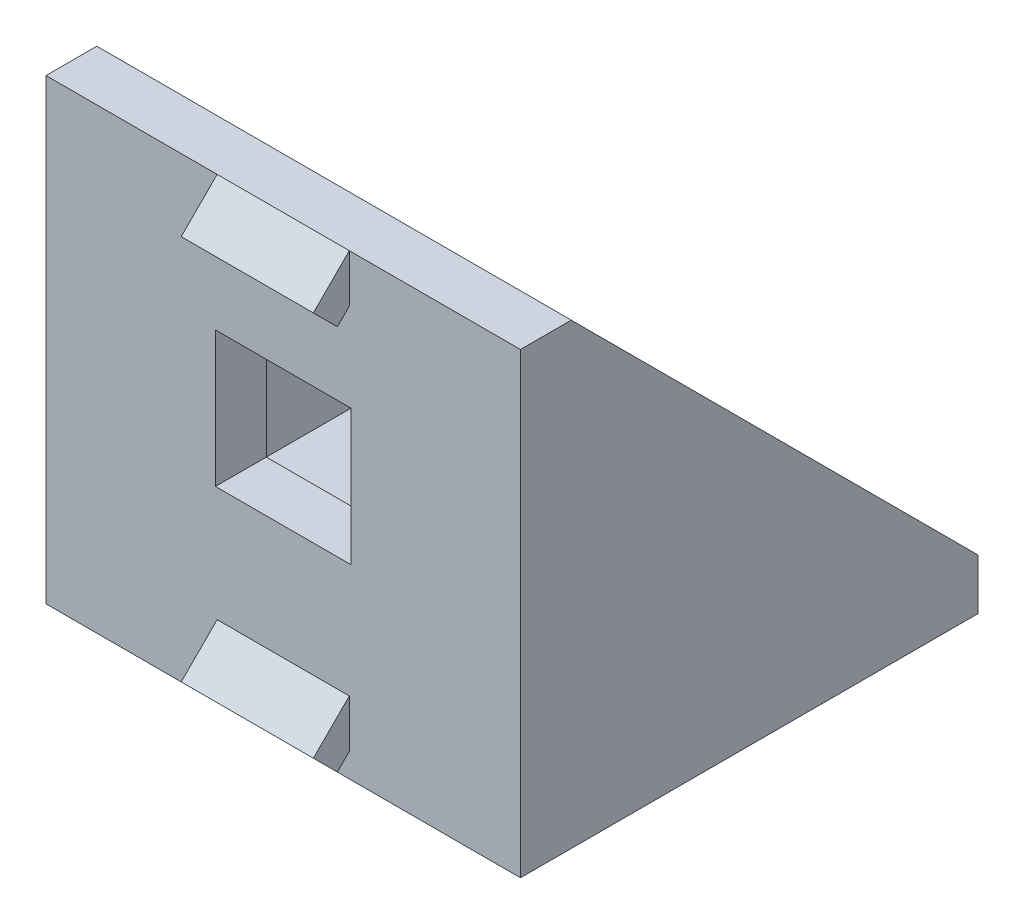
ISO-10303-21;
HEADER;
FILE_DESCRIPTION(('STEP AP214'),'2;1');
FILE_NAME('part.step','',(''),(''),'','','');
FILE_SCHEMA(('AUTOMOTIVE_DESIGN { 1 0 10303 214 1 1 1 1 }'));
ENDSEC;
DATA;
#1=APPLICATION_CONTEXT('core data for automotive mechanical design processes');
#2=APPLICATION_PROTOCOL_DEFINITION('international standard','automotive_design',2000,#1);
#3=PRODUCT_CONTEXT('',#1,'mechanical');
#4=PRODUCT('Part','Part','',(#3));
#5=PRODUCT_RELATED_PRODUCT_CATEGORY('part','',(#4));
#6=PRODUCT_DEFINITION_FORMATION('','',#4);
#7=PRODUCT_DEFINITION_CONTEXT('part definition',#1,'design');
#8=PRODUCT_DEFINITION('design','',#6,#7);
#9=PRODUCT_DEFINITION_SHAPE('','',#8);
#10=(LENGTH_UNIT() NAMED_UNIT(*) SI_UNIT(.MILLI.,.METRE.));
#11=(NAMED_UNIT(*) PLANE_ANGLE_UNIT() SI_UNIT($,.RADIAN.));
#12=(NAMED_UNIT(*) SI_UNIT($,.STERADIAN.) SOLID_ANGLE_UNIT());
#13=UNCERTAINTY_MEASURE_WITH_UNIT(LENGTH_MEASURE(1.E-05),#10,'distance_accuracy_value','');
#14=(GEOMETRIC_REPRESENTATION_CONTEXT(3) GLOBAL_UNCERTAINTY_ASSIGNED_CONTEXT((#13)) GLOBAL_UNIT_ASSIGNED_CONTEXT((#10,
#11,#12)) REPRESENTATION_CONTEXT('',''));
#15=CARTESIAN_POINT('',(0.,0.,0.));
#16=DIRECTION('',(0.,0.,1.));
#17=DIRECTION('',(1.,0.,0.));
#18=AXIS2_PLACEMENT_3D('',#15,#16,#17);
#19=CARTESIAN_POINT('',(28.,0.,0.));
#20=DIRECTION('',(0.,1.,0.));
#21=DIRECTION('',(0.,0.,1.));
#22=AXIS2_PLACEMENT_3D('',#19,#20,#21);
#23=PLANE('',#22);
#24=DIRECTION('',(-1.,0.,0.));
#25=VECTOR('',#24,1.);
#26=CARTESIAN_POINT('',(28.,0.,-27.));
#27=LINE('',#26,#25);
#28=CARTESIAN_POINT('',(10.1,0.,-27.));
#29=VERTEX_POINT('',#28);
#30=CARTESIAN_POINT('',(0.,0.,-27.));
#31=VERTEX_POINT('',#30);
#32=EDGE_CURVE('E482',#29,#31,#27,.T.);
#33=ORIENTED_EDGE('',*,*,#32,.F.);
#34=DIRECTION('',(0.,0.,1.));
#35=VECTOR('',#34,1.);
#36=CARTESIAN_POINT('',(10.1,0.,-24.1715728752538));
#37=LINE('',#36,#35);
#38=CARTESIAN_POINT('',(10.1,0.,-24.1715728752538));
#39=VERTEX_POINT('',#38);
#40=EDGE_CURVE('E333',#29,#39,#37,.T.);
#41=ORIENTED_EDGE('',*,*,#40,.T.);
#42=DIRECTION('',(-1.,0.,0.));
#43=VECTOR('',#42,1.);
#44=CARTESIAN_POINT('',(17.9,0.,-24.1715728752538));
#45=LINE('',#44,#43);
#46=CARTESIAN_POINT('',(17.9,0.,-24.1715728752538));
#47=VERTEX_POINT('',#46);
#48=EDGE_CURVE('E361',#47,#39,#45,.T.);
#49=ORIENTED_EDGE('',*,*,#48,.F.);
#50=DIRECTION('',(0.,0.,1.));
#51=VECTOR('',#50,1.);
#52=CARTESIAN_POINT('',(17.9,0.,-24.1715728752538));
#53=LINE('',#52,#51);
#54=CARTESIAN_POINT('',(17.9,0.,-27.));
#55=VERTEX_POINT('',#54);
#56=EDGE_CURVE('E334',#55,#47,#53,.T.);
#57=ORIENTED_EDGE('',*,*,#56,.F.);
#58=CARTESIAN_POINT('',(28.,0.,-27.));
#59=VERTEX_POINT('',#58);
#60=EDGE_CURVE('E483',#59,#55,#27,.T.);
#61=ORIENTED_EDGE('',*,*,#60,.F.);
#62=DIRECTION('',(0.,0.,-1.));
#63=VECTOR('',#62,1.);
#64=CARTESIAN_POINT('',(28.,0.,0.));
#65=LINE('',#64,#63);
#66=CARTESIAN_POINT('',(28.,0.,0.));
#67=VERTEX_POINT('',#66);
#68=EDGE_CURVE('E444',#67,#59,#65,.T.);
#69=ORIENTED_EDGE('',*,*,#68,.F.);
#70=DIRECTION('',(-1.,0.,0.));
#71=VECTOR('',#70,1.);
#72=CARTESIAN_POINT('',(28.,0.,0.));
#73=LINE('',#72,#71);
#74=CARTESIAN_POINT('',(0.,0.,0.));
#75=VERTEX_POINT('',#74);
#76=EDGE_CURVE('E456',#67,#75,#73,.T.);
#77=ORIENTED_EDGE('',*,*,#76,.T.);
#78=DIRECTION('',(0.,0.,-1.));
#79=VECTOR('',#78,1.);
#80=CARTESIAN_POINT('',(0.,0.,0.));
#81=LINE('',#80,#79);
#82=EDGE_CURVE('E443',#75,#31,#81,.T.);
#83=ORIENTED_EDGE('',*,*,#82,.T.);
#84=EDGE_LOOP('',(#33,#41,#49,#57,#61,#69,#77,#83));
#85=FACE_BOUND('',#84,.T.);
#86=DIRECTION('',(1.,0.,0.));
#87=VECTOR('',#86,1.);
#88=CARTESIAN_POINT('',(10.,0.,-19.));
#89=LINE('',#88,#87);
#90=CARTESIAN_POINT('',(10.,0.,-19.));
#91=VERTEX_POINT('',#90);
#92=CARTESIAN_POINT('',(18.,0.,-19.));
#93=VERTEX_POINT('',#92);
#94=EDGE_CURVE('E366',#91,#93,#89,.T.);
#95=ORIENTED_EDGE('',*,*,#94,.F.);
#96=DIRECTION('',(0.,0.,-1.));
#97=VECTOR('',#96,1.);
#98=CARTESIAN_POINT('',(10.,0.,-11.));
#99=LINE('',#98,#97);
#100=CARTESIAN_POINT('',(10.,0.,-11.));
#101=VERTEX_POINT('',#100);
#102=EDGE_CURVE('E369',#101,#91,#99,.T.);
#103=ORIENTED_EDGE('',*,*,#102,.F.);
#104=DIRECTION('',(-1.,0.,0.));
#105=VECTOR('',#104,1.);
#106=CARTESIAN_POINT('',(10.,0.,-11.));
#107=LINE('',#106,#105);
#108=CARTESIAN_POINT('',(18.,0.,-11.));
#109=VERTEX_POINT('',#108);
#110=EDGE_CURVE('E386',#109,#101,#107,.T.);
#111=ORIENTED_EDGE('',*,*,#110,.F.);
#112=DIRECTION('',(0.,0.,1.));
#113=VECTOR('',#112,1.);
#114=CARTESIAN_POINT('',(18.,0.,-11.));
#115=LINE('',#114,#113);
#116=EDGE_CURVE('E364',#93,#109,#115,.T.);
#117=ORIENTED_EDGE('',*,*,#116,.F.);
#118=EDGE_LOOP('',(#95,#103,#111,#117));
#119=FACE_BOUND('',#118,.T.);
#120=DIRECTION('',(0.,0.,1.));
#121=VECTOR('',#120,1.);
#122=CARTESIAN_POINT('',(17.9,0.,-1.41421356237308));
#123=LINE('',#122,#121);
#124=CARTESIAN_POINT('',(17.9,0.,-4.24264068711928));
#125=VERTEX_POINT('',#124);
#126=CARTESIAN_POINT('',(17.9,0.,-1.41421356237308));
#127=VERTEX_POINT('',#126);
#128=EDGE_CURVE('E305',#125,#127,#123,.T.);
#129=ORIENTED_EDGE('',*,*,#128,.F.);
#130=DIRECTION('',(-1.,0.,0.));
#131=VECTOR('',#130,1.);
#132=CARTESIAN_POINT('',(17.9,0.,-4.24264068711928));
#133=LINE('',#132,#131);
#134=CARTESIAN_POINT('',(10.1,0.,-4.24264068711928));
#135=VERTEX_POINT('',#134);
#136=EDGE_CURVE('E315',#125,#135,#133,.T.);
#137=ORIENTED_EDGE('',*,*,#136,.T.);
#138=DIRECTION('',(0.,0.,1.));
#139=VECTOR('',#138,1.);
#140=CARTESIAN_POINT('',(10.1,0.,-1.41421356237308));
#141=LINE('',#140,#139);
#142=CARTESIAN_POINT('',(10.1,0.,-1.41421356237308));
#143=VERTEX_POINT('',#142);
#144=EDGE_CURVE('E304',#135,#143,#141,.T.);
#145=ORIENTED_EDGE('',*,*,#144,.T.);
#146=DIRECTION('',(-1.,0.,0.));
#147=VECTOR('',#146,1.);
#148=CARTESIAN_POINT('',(17.9,0.,-1.41421356237308));
#149=LINE('',#148,#147);
#150=EDGE_CURVE('E331',#127,#143,#149,.T.);
#151=ORIENTED_EDGE('',*,*,#150,.F.);
#152=EDGE_LOOP('',(#129,#137,#145,#151));
#153=FACE_BOUND('',#152,.T.);
#154=ADVANCED_FACE('F38',(#85,#119,#153),#23,.F.);
#155=CARTESIAN_POINT('',(28.,27.,-3.));
#156=DIRECTION('',(0.,-0.707106781186547,0.707106781186547));
#157=DIRECTION('',(0.,-0.707106781186548,-0.707106781186548));
#158=AXIS2_PLACEMENT_3D('',#155,#156,#157);
#159=PLANE('',#158);
#160=DIRECTION('',(-1.,0.,0.));
#161=VECTOR('',#160,1.);
#162=CARTESIAN_POINT('',(28.,27.,-3.));
#163=LINE('',#162,#161);
#164=CARTESIAN_POINT('',(2.,27.,-3.));
#165=VERTEX_POINT('',#164);
#166=CARTESIAN_POINT('',(0.,27.,-3.));
#167=VERTEX_POINT('',#166);
#168=EDGE_CURVE('E474',#165,#167,#163,.T.);
#169=ORIENTED_EDGE('',*,*,#168,.F.);
#170=DIRECTION('',(0.,-0.707106781186547,-0.707106781186547));
#171=VECTOR('',#170,1.);
#172=CARTESIAN_POINT('',(2.,27.,-3.));
#173=LINE('',#172,#171);
#174=CARTESIAN_POINT('',(2.,3.,-27.));
#175=VERTEX_POINT('',#174);
#176=EDGE_CURVE('E12',#165,#175,#173,.T.);
#177=ORIENTED_EDGE('',*,*,#176,.T.);
#178=DIRECTION('',(-1.,0.,0.));
#179=VECTOR('',#178,1.);
#180=CARTESIAN_POINT('',(28.,3.,-27.));
#181=LINE('',#180,#179);
#182=CARTESIAN_POINT('',(0.,3.,-27.));
#183=VERTEX_POINT('',#182);
#184=EDGE_CURVE('E478',#175,#183,#181,.T.);
#185=ORIENTED_EDGE('',*,*,#184,.T.);
#186=DIRECTION('',(0.,0.707106781186548,0.707106781186548));
#187=VECTOR('',#186,1.);
#188=CARTESIAN_POINT('',(0.,27.,-3.));
#189=LINE('',#188,#187);
#190=EDGE_CURVE('E462',#183,#167,#189,.T.);
#191=ORIENTED_EDGE('',*,*,#190,.T.);
#192=EDGE_LOOP('',(#169,#177,#185,#191));
#193=FACE_BOUND('',#192,.T.);
#194=ADVANCED_FACE('F514',(#193),#159,.F.);
#195=CARTESIAN_POINT('',(28.,3.,-27.));
#196=DIRECTION('',(0.,0.,1.));
#197=DIRECTION('',(1.,0.,0.));
#198=AXIS2_PLACEMENT_3D('',#195,#196,#197);
#199=PLANE('',#198);
#200=DIRECTION('',(0.,1.,0.));
#201=VECTOR('',#200,1.);
#202=CARTESIAN_POINT('',(0.,3.,-27.));
#203=LINE('',#202,#201);
#204=EDGE_CURVE('E459',#31,#183,#203,.T.);
#205=ORIENTED_EDGE('',*,*,#204,.T.);
#206=ORIENTED_EDGE('',*,*,#184,.F.);
#207=DIRECTION('',(-1.,0.,0.));
#208=VECTOR('',#207,1.);
#209=CARTESIAN_POINT('',(2.,3.,-27.));
#210=LINE('',#209,#208);
#211=CARTESIAN_POINT('',(26.,3.,-27.));
#212=VERTEX_POINT('',#211);
#213=EDGE_CURVE('E426',#212,#175,#210,.T.);
#214=ORIENTED_EDGE('',*,*,#213,.F.);
#215=CARTESIAN_POINT('',(28.,3.,-27.));
#216=VERTEX_POINT('',#215);
#217=EDGE_CURVE('E479',#216,#212,#181,.T.);
#218=ORIENTED_EDGE('',*,*,#217,.F.);
#219=DIRECTION('',(0.,1.,0.));
#220=VECTOR('',#219,1.);
#221=CARTESIAN_POINT('',(28.,3.,-27.));
#222=LINE('',#221,#220);
#223=EDGE_CURVE('E447',#59,#216,#222,.T.);
#224=ORIENTED_EDGE('',*,*,#223,.F.);
#225=ORIENTED_EDGE('',*,*,#60,.T.);
#226=DIRECTION('',(-1.,0.,0.));
#227=VECTOR('',#226,1.);
#228=CARTESIAN_POINT('',(17.9,0.,-27.));
#229=LINE('',#228,#227);
#230=EDGE_CURVE('E345',#55,#29,#229,.T.);
#231=ORIENTED_EDGE('',*,*,#230,.T.);
#232=ORIENTED_EDGE('',*,*,#32,.T.);
#233=EDGE_LOOP('',(#205,#206,#214,#218,#224,#225,#231,#232));
#234=FACE_BOUND('',#233,.T.);
#235=ADVANCED_FACE('F506',(#234),#199,.F.);
#236=ORIENTED_EDGE('',*,*,#217,.T.);
#237=DIRECTION('',(0.,0.707106781186547,0.707106781186547));
#238=VECTOR('',#237,1.);
#239=CARTESIAN_POINT('',(26.,27.,-3.));
#240=LINE('',#239,#238);
#241=CARTESIAN_POINT('',(26.,27.,-2.99999999999999));
#242=VERTEX_POINT('',#241);
#243=EDGE_CURVE('E45',#212,#242,#240,.T.);
#244=ORIENTED_EDGE('',*,*,#243,.T.);
#245=CARTESIAN_POINT('',(28.,27.,-3.));
#246=VERTEX_POINT('',#245);
#247=EDGE_CURVE('E475',#246,#242,#163,.T.);
#248=ORIENTED_EDGE('',*,*,#247,.F.);
#249=DIRECTION('',(0.,0.707106781186548,0.707106781186548));
#250=VECTOR('',#249,1.);
#251=CARTESIAN_POINT('',(28.,27.,-3.));
#252=LINE('',#251,#250);
#253=EDGE_CURVE('E450',#216,#246,#252,.T.);
#254=ORIENTED_EDGE('',*,*,#253,.F.);
#255=EDGE_LOOP('',(#236,#244,#248,#254));
#256=FACE_BOUND('',#255,.T.);
#257=ADVANCED_FACE('F488',(#256),#159,.F.);
#258=CARTESIAN_POINT('',(28.,27.,0.));
#259=DIRECTION('',(0.,-1.,0.));
#260=DIRECTION('',(0.,0.,-1.));
#261=AXIS2_PLACEMENT_3D('',#258,#259,#260);
#262=PLANE('',#261);
#263=DIRECTION('',(0.,0.,1.));
#264=VECTOR('',#263,1.);
#265=CARTESIAN_POINT('',(0.,27.,0.));
#266=LINE('',#265,#264);
#267=CARTESIAN_POINT('',(0.,27.,0.));
#268=VERTEX_POINT('',#267);
#269=EDGE_CURVE('E465',#167,#268,#266,.T.);
#270=ORIENTED_EDGE('',*,*,#269,.T.);
#271=DIRECTION('',(-1.,0.,0.));
#272=VECTOR('',#271,1.);
#273=CARTESIAN_POINT('',(28.,27.,0.));
#274=LINE('',#273,#272);
#275=CARTESIAN_POINT('',(10.1,27.,0.));
#276=VERTEX_POINT('',#275);
#277=EDGE_CURVE('E471',#276,#268,#274,.T.);
#278=ORIENTED_EDGE('',*,*,#277,.F.);
#279=DIRECTION('',(-1.,0.,0.));
#280=VECTOR('',#279,1.);
#281=CARTESIAN_POINT('',(17.9,27.,0.));
#282=LINE('',#281,#280);
#283=CARTESIAN_POINT('',(17.9,27.,0.));
#284=VERTEX_POINT('',#283);
#285=EDGE_CURVE('E660',#284,#276,#282,.T.);
#286=ORIENTED_EDGE('',*,*,#285,.F.);
#287=CARTESIAN_POINT('',(28.,27.,0.));
#288=VERTEX_POINT('',#287);
#289=EDGE_CURVE('E472',#288,#284,#274,.T.);
#290=ORIENTED_EDGE('',*,*,#289,.F.);
#291=DIRECTION('',(0.,0.,1.));
#292=VECTOR('',#291,1.);
#293=CARTESIAN_POINT('',(28.,27.,0.));
#294=LINE('',#293,#292);
#295=EDGE_CURVE('E452',#246,#288,#294,.T.);
#296=ORIENTED_EDGE('',*,*,#295,.F.);
#297=ORIENTED_EDGE('',*,*,#247,.T.);
#298=DIRECTION('',(-1.,0.,0.));
#299=VECTOR('',#298,1.);
#300=CARTESIAN_POINT('',(2.,27.,-3.));
#301=LINE('',#300,#299);
#302=EDGE_CURVE('E434',#242,#165,#301,.T.);
#303=ORIENTED_EDGE('',*,*,#302,.T.);
#304=ORIENTED_EDGE('',*,*,#168,.T.);
#305=EDGE_LOOP('',(#270,#278,#286,#290,#296,#297,#303,#304));
#306=FACE_BOUND('',#305,.T.);
#307=ADVANCED_FACE('F495',(#306),#262,.F.);
#308=CARTESIAN_POINT('',(28.,0.,0.));
#309=DIRECTION('',(0.,0.,-1.));
#310=DIRECTION('',(-1.,0.,0.));
#311=AXIS2_PLACEMENT_3D('',#308,#309,#310);
#312=PLANE('',#311);
#313=DIRECTION('',(-1.,0.,0.));
#314=VECTOR('',#313,1.);
#315=CARTESIAN_POINT('',(17.9,4.24264068711882,-1.56502576304842E-13));
#316=LINE('',#315,#314);
#317=CARTESIAN_POINT('',(17.9,4.24264068711866,0.));
#318=VERTEX_POINT('',#317);
#319=CARTESIAN_POINT('',(10.1,4.24264068711882,0.));
#320=VERTEX_POINT('',#319);
#321=EDGE_CURVE('E287',#318,#320,#316,.T.);
#322=ORIENTED_EDGE('',*,*,#321,.F.);
#323=DIRECTION('',(0.,1.,-1.65607518986913E-13));
#324=VECTOR('',#323,1.);
#325=CARTESIAN_POINT('',(17.9,1.4142135623733,3.11906222459551E-13));
#326=LINE('',#325,#324);
#327=CARTESIAN_POINT('',(17.9,1.41421356237361,0.));
#328=VERTEX_POINT('',#327);
#329=EDGE_CURVE('E285',#328,#318,#326,.T.);
#330=ORIENTED_EDGE('',*,*,#329,.F.);
#331=DIRECTION('',(-1.,0.,0.));
#332=VECTOR('',#331,1.);
#333=CARTESIAN_POINT('',(17.9,1.4142135623733,3.11906222459551E-13));
#334=LINE('',#333,#332);
#335=CARTESIAN_POINT('',(10.1,1.4142135623733,3.11906222459551E-13));
#336=VERTEX_POINT('',#335);
#337=EDGE_CURVE('E296',#328,#336,#334,.T.);
#338=ORIENTED_EDGE('',*,*,#337,.T.);
#339=DIRECTION('',(0.,1.,-1.65607518986913E-13));
#340=VECTOR('',#339,1.);
#341=CARTESIAN_POINT('',(10.1,1.4142135623733,3.11906222459551E-13));
#342=LINE('',#341,#340);
#343=EDGE_CURVE('E280',#336,#320,#342,.T.);
#344=ORIENTED_EDGE('',*,*,#343,.T.);
#345=EDGE_LOOP('',(#322,#330,#338,#344));
#346=FACE_BOUND('',#345,.T.);
#347=DIRECTION('',(1.,0.,0.));
#348=VECTOR('',#347,1.);
#349=CARTESIAN_POINT('',(10.,11.,0.));
#350=LINE('',#349,#348);
#351=CARTESIAN_POINT('',(10.,11.,0.));
#352=VERTEX_POINT('',#351);
#353=CARTESIAN_POINT('',(18.,11.,0.));
#354=VERTEX_POINT('',#353);
#355=EDGE_CURVE('E397',#352,#354,#350,.T.);
#356=ORIENTED_EDGE('',*,*,#355,.F.);
#357=DIRECTION('',(0.,-1.,0.));
#358=VECTOR('',#357,1.);
#359=CARTESIAN_POINT('',(10.,19.,0.));
#360=LINE('',#359,#358);
#361=CARTESIAN_POINT('',(10.,19.,0.));
#362=VERTEX_POINT('',#361);
#363=EDGE_CURVE('E400',#362,#352,#360,.T.);
#364=ORIENTED_EDGE('',*,*,#363,.F.);
#365=DIRECTION('',(-1.,0.,0.));
#366=VECTOR('',#365,1.);
#367=CARTESIAN_POINT('',(10.,19.,0.));
#368=LINE('',#367,#366);
#369=CARTESIAN_POINT('',(18.,19.,0.));
#370=VERTEX_POINT('',#369);
#371=EDGE_CURVE('E417',#370,#362,#368,.T.);
#372=ORIENTED_EDGE('',*,*,#371,.F.);
#373=DIRECTION('',(0.,1.,0.));
#374=VECTOR('',#373,1.);
#375=CARTESIAN_POINT('',(18.,19.,0.));
#376=LINE('',#375,#374);
#377=EDGE_CURVE('E395',#354,#370,#376,.T.);
#378=ORIENTED_EDGE('',*,*,#377,.F.);
#379=EDGE_LOOP('',(#356,#364,#372,#378));
#380=FACE_BOUND('',#379,.T.);
#381=ORIENTED_EDGE('',*,*,#289,.T.);
#382=DIRECTION('',(0.,1.,-2.38185905000715E-13));
#383=VECTOR('',#382,1.);
#384=CARTESIAN_POINT('',(17.9,27.,0.));
#385=LINE('',#384,#383);
#386=CARTESIAN_POINT('',(17.9,24.1715728752552,0.));
#387=VERTEX_POINT('',#386);
#388=EDGE_CURVE('E52',#387,#284,#385,.T.);
#389=ORIENTED_EDGE('',*,*,#388,.F.);
#390=DIRECTION('',(-1.,0.,0.));
#391=VECTOR('',#390,1.);
#392=CARTESIAN_POINT('',(17.9,24.1715728752545,6.73691474436078E-13));
#393=LINE('',#392,#391);
#394=CARTESIAN_POINT('',(10.1,24.1715728752545,6.73691474436078E-13));
#395=VERTEX_POINT('',#394);
#396=EDGE_CURVE('E272',#387,#395,#393,.T.);
#397=ORIENTED_EDGE('',*,*,#396,.T.);
#398=DIRECTION('',(0.,1.,-2.38185905000715E-13));
#399=VECTOR('',#398,1.);
#400=CARTESIAN_POINT('',(10.1,27.,0.));
#401=LINE('',#400,#399);
#402=EDGE_CURVE('E58',#395,#276,#401,.T.);
#403=ORIENTED_EDGE('',*,*,#402,.T.);
#404=ORIENTED_EDGE('',*,*,#277,.T.);
#405=DIRECTION('',(0.,-1.,0.));
#406=VECTOR('',#405,1.);
#407=CARTESIAN_POINT('',(0.,0.,0.));
#408=LINE('',#407,#406);
#409=EDGE_CURVE('E448',#268,#75,#408,.T.);
#410=ORIENTED_EDGE('',*,*,#409,.T.);
#411=ORIENTED_EDGE('',*,*,#76,.F.);
#412=DIRECTION('',(0.,-1.,0.));
#413=VECTOR('',#412,1.);
#414=CARTESIAN_POINT('',(28.,0.,0.));
#415=LINE('',#414,#413);
#416=EDGE_CURVE('E454',#288,#67,#415,.T.);
#417=ORIENTED_EDGE('',*,*,#416,.F.);
#418=EDGE_LOOP('',(#381,#389,#397,#403,#404,#410,#411,#417));
#419=FACE_BOUND('',#418,.T.);
#420=ADVANCED_FACE('F640',(#346,#380,#419),#312,.F.);
#421=CARTESIAN_POINT('',(28.,0.,0.));
#422=DIRECTION('',(-1.,0.,0.));
#423=DIRECTION('',(0.,0.,1.));
#424=AXIS2_PLACEMENT_3D('',#421,#422,#423);
#425=PLANE('',#424);
#426=ORIENTED_EDGE('',*,*,#68,.T.);
#427=ORIENTED_EDGE('',*,*,#223,.T.);
#428=ORIENTED_EDGE('',*,*,#253,.T.);
#429=ORIENTED_EDGE('',*,*,#295,.T.);
#430=ORIENTED_EDGE('',*,*,#416,.T.);
#431=EDGE_LOOP('',(#426,#427,#428,#429,#430));
#432=FACE_BOUND('',#431,.T.);
#433=ADVANCED_FACE('F500',(#432),#425,.F.);
#434=CARTESIAN_POINT('',(0.,0.,0.));
#435=DIRECTION('',(-1.,0.,0.));
#436=DIRECTION('',(0.,0.,1.));
#437=AXIS2_PLACEMENT_3D('',#434,#435,#436);
#438=PLANE('',#437);
#439=ORIENTED_EDGE('',*,*,#82,.F.);
#440=ORIENTED_EDGE('',*,*,#409,.F.);
#441=ORIENTED_EDGE('',*,*,#269,.F.);
#442=ORIENTED_EDGE('',*,*,#190,.F.);
#443=ORIENTED_EDGE('',*,*,#204,.F.);
#444=EDGE_LOOP('',(#439,#440,#441,#442,#443));
#445=FACE_BOUND('',#444,.T.);
#446=ADVANCED_FACE('F530',(#445),#438,.T.);
#447=CARTESIAN_POINT('',(2.,3.,33.9411254969543));
#448=DIRECTION('',(-1.,0.,0.));
#449=DIRECTION('',(0.,0.,1.));
#450=AXIS2_PLACEMENT_3D('',#447,#448,#449);
#451=PLANE('',#450);
#452=DIRECTION('',(0.,-1.,0.));
#453=VECTOR('',#452,1.);
#454=CARTESIAN_POINT('',(2.,3.,-3.));
#455=LINE('',#454,#453);
#456=CARTESIAN_POINT('',(2.,3.,-3.));
#457=VERTEX_POINT('',#456);
#458=EDGE_CURVE('E432',#165,#457,#455,.T.);
#459=ORIENTED_EDGE('',*,*,#458,.T.);
#460=DIRECTION('',(0.,0.,-1.));
#461=VECTOR('',#460,1.);
#462=CARTESIAN_POINT('',(2.,3.,33.9411254969543));
#463=LINE('',#462,#461);
#464=EDGE_CURVE('E430',#457,#175,#463,.T.);
#465=ORIENTED_EDGE('',*,*,#464,.T.);
#466=ORIENTED_EDGE('',*,*,#176,.F.);
#467=EDGE_LOOP('',(#459,#465,#466));
#468=FACE_BOUND('',#467,.T.);
#469=ADVANCED_FACE('F516',(#468),#451,.F.);
#470=CARTESIAN_POINT('',(26.,3.,33.9411254969543));
#471=DIRECTION('',(1.,0.,0.));
#472=DIRECTION('',(0.,0.,-1.));
#473=AXIS2_PLACEMENT_3D('',#470,#471,#472);
#474=PLANE('',#473);
#475=DIRECTION('',(0.,0.,-1.));
#476=VECTOR('',#475,1.);
#477=CARTESIAN_POINT('',(26.,3.,33.9411254969543));
#478=LINE('',#477,#476);
#479=CARTESIAN_POINT('',(26.,3.,-3.));
#480=VERTEX_POINT('',#479);
#481=EDGE_CURVE('E437',#480,#212,#478,.T.);
#482=ORIENTED_EDGE('',*,*,#481,.F.);
#483=DIRECTION('',(0.,1.,0.));
#484=VECTOR('',#483,1.);
#485=CARTESIAN_POINT('',(26.,3.,-3.));
#486=LINE('',#485,#484);
#487=EDGE_CURVE('E427',#480,#242,#486,.T.);
#488=ORIENTED_EDGE('',*,*,#487,.T.);
#489=ORIENTED_EDGE('',*,*,#243,.F.);
#490=EDGE_LOOP('',(#482,#488,#489));
#491=FACE_BOUND('',#490,.T.);
#492=ADVANCED_FACE('F521',(#491),#474,.F.);
#493=CARTESIAN_POINT('',(2.,3.,33.9411254969543));
#494=DIRECTION('',(0.,-1.,0.));
#495=DIRECTION('',(1.,0.,0.));
#496=AXIS2_PLACEMENT_3D('',#493,#494,#495);
#497=PLANE('',#496);
#498=DIRECTION('',(1.,0.,0.));
#499=VECTOR('',#498,1.);
#500=CARTESIAN_POINT('',(10.,3.,-11.));
#501=LINE('',#500,#499);
#502=CARTESIAN_POINT('',(10.,3.,-11.));
#503=VERTEX_POINT('',#502);
#504=CARTESIAN_POINT('',(18.,3.,-11.));
#505=VERTEX_POINT('',#504);
#506=EDGE_CURVE('E374',#503,#505,#501,.T.);
#507=ORIENTED_EDGE('',*,*,#506,.F.);
#508=DIRECTION('',(0.,0.,1.));
#509=VECTOR('',#508,1.);
#510=CARTESIAN_POINT('',(10.,3.,-11.));
#511=LINE('',#510,#509);
#512=CARTESIAN_POINT('',(10.,3.,-19.));
#513=VERTEX_POINT('',#512);
#514=EDGE_CURVE('E372',#513,#503,#511,.T.);
#515=ORIENTED_EDGE('',*,*,#514,.F.);
#516=DIRECTION('',(-1.,0.,0.));
#517=VECTOR('',#516,1.);
#518=CARTESIAN_POINT('',(10.,3.,-19.));
#519=LINE('',#518,#517);
#520=CARTESIAN_POINT('',(18.,3.,-19.));
#521=VERTEX_POINT('',#520);
#522=EDGE_CURVE('E380',#521,#513,#519,.T.);
#523=ORIENTED_EDGE('',*,*,#522,.F.);
#524=DIRECTION('',(0.,0.,-1.));
#525=VECTOR('',#524,1.);
#526=CARTESIAN_POINT('',(18.,3.,-11.));
#527=LINE('',#526,#525);
#528=EDGE_CURVE('E377',#505,#521,#527,.T.);
#529=ORIENTED_EDGE('',*,*,#528,.F.);
#530=EDGE_LOOP('',(#507,#515,#523,#529));
#531=FACE_BOUND('',#530,.T.);
#532=DIRECTION('',(1.,0.,0.));
#533=VECTOR('',#532,1.);
#534=CARTESIAN_POINT('',(2.,3.,-3.));
#535=LINE('',#534,#533);
#536=EDGE_CURVE('E429',#457,#480,#535,.T.);
#537=ORIENTED_EDGE('',*,*,#536,.T.);
#538=ORIENTED_EDGE('',*,*,#481,.T.);
#539=ORIENTED_EDGE('',*,*,#213,.T.);
#540=ORIENTED_EDGE('',*,*,#464,.F.);
#541=EDGE_LOOP('',(#537,#538,#539,#540));
#542=FACE_BOUND('',#541,.T.);
#543=ADVANCED_FACE('F510',(#531,#542),#497,.F.);
#544=CARTESIAN_POINT('',(28.,0.,-3.));
#545=DIRECTION('',(0.,0.,-1.));
#546=DIRECTION('',(-1.,0.,0.));
#547=AXIS2_PLACEMENT_3D('',#544,#545,#546);
#548=PLANE('',#547);
#549=DIRECTION('',(0.,1.,0.));
#550=VECTOR('',#549,1.);
#551=CARTESIAN_POINT('',(10.,19.,-3.));
#552=LINE('',#551,#550);
#553=CARTESIAN_POINT('',(10.,11.,-3.));
#554=VERTEX_POINT('',#553);
#555=CARTESIAN_POINT('',(10.,19.,-3.));
#556=VERTEX_POINT('',#555);
#557=EDGE_CURVE('E403',#554,#556,#552,.T.);
#558=ORIENTED_EDGE('',*,*,#557,.F.);
#559=DIRECTION('',(-1.,0.,0.));
#560=VECTOR('',#559,1.);
#561=CARTESIAN_POINT('',(10.,11.,-3.));
#562=LINE('',#561,#560);
#563=CARTESIAN_POINT('',(18.,11.,-3.));
#564=VERTEX_POINT('',#563);
#565=EDGE_CURVE('E411',#564,#554,#562,.T.);
#566=ORIENTED_EDGE('',*,*,#565,.F.);
#567=DIRECTION('',(0.,-1.,0.));
#568=VECTOR('',#567,1.);
#569=CARTESIAN_POINT('',(18.,19.,-3.));
#570=LINE('',#569,#568);
#571=CARTESIAN_POINT('',(18.,19.,-3.));
#572=VERTEX_POINT('',#571);
#573=EDGE_CURVE('E408',#572,#564,#570,.T.);
#574=ORIENTED_EDGE('',*,*,#573,.F.);
#575=DIRECTION('',(1.,0.,0.));
#576=VECTOR('',#575,1.);
#577=CARTESIAN_POINT('',(10.,19.,-3.));
#578=LINE('',#577,#576);
#579=EDGE_CURVE('E405',#556,#572,#578,.T.);
#580=ORIENTED_EDGE('',*,*,#579,.F.);
#581=EDGE_LOOP('',(#558,#566,#574,#580));
#582=FACE_BOUND('',#581,.T.);
#583=ORIENTED_EDGE('',*,*,#458,.F.);
#584=ORIENTED_EDGE('',*,*,#302,.F.);
#585=ORIENTED_EDGE('',*,*,#487,.F.);
#586=ORIENTED_EDGE('',*,*,#536,.F.);
#587=EDGE_LOOP('',(#583,#584,#585,#586));
#588=FACE_BOUND('',#587,.T.);
#589=ADVANCED_FACE('F520',(#582,#588),#548,.T.);
#590=CARTESIAN_POINT('',(10.,19.,0.00100000000000013));
#591=DIRECTION('',(-1.,0.,0.));
#592=DIRECTION('',(0.,-1.,0.));
#593=AXIS2_PLACEMENT_3D('',#590,#591,#592);
#594=PLANE('',#593);
#595=ORIENTED_EDGE('',*,*,#363,.T.);
#596=DIRECTION('',(0.,0.,-1.));
#597=VECTOR('',#596,1.);
#598=CARTESIAN_POINT('',(10.,11.,0.00100000000000013));
#599=LINE('',#598,#597);
#600=EDGE_CURVE('E415',#352,#554,#599,.T.);
#601=ORIENTED_EDGE('',*,*,#600,.T.);
#602=ORIENTED_EDGE('',*,*,#557,.T.);
#603=DIRECTION('',(0.,0.,-1.));
#604=VECTOR('',#603,1.);
#605=CARTESIAN_POINT('',(10.,19.,0.00100000000000013));
#606=LINE('',#605,#604);
#607=EDGE_CURVE('E414',#362,#556,#606,.T.);
#608=ORIENTED_EDGE('',*,*,#607,.F.);
#609=EDGE_LOOP('',(#595,#601,#602,#608));
#610=FACE_BOUND('',#609,.T.);
#611=ADVANCED_FACE('F615',(#610),#594,.F.);
#612=CARTESIAN_POINT('',(10.,11.,0.00100000000000013));
#613=DIRECTION('',(0.,-1.,0.));
#614=DIRECTION('',(1.,0.,0.));
#615=AXIS2_PLACEMENT_3D('',#612,#613,#614);
#616=PLANE('',#615);
#617=ORIENTED_EDGE('',*,*,#355,.T.);
#618=DIRECTION('',(0.,0.,-1.));
#619=VECTOR('',#618,1.);
#620=CARTESIAN_POINT('',(18.,11.,0.00100000000000013));
#621=LINE('',#620,#619);
#622=EDGE_CURVE('E418',#354,#564,#621,.T.);
#623=ORIENTED_EDGE('',*,*,#622,.T.);
#624=ORIENTED_EDGE('',*,*,#565,.T.);
#625=ORIENTED_EDGE('',*,*,#600,.F.);
#626=EDGE_LOOP('',(#617,#623,#624,#625));
#627=FACE_BOUND('',#626,.T.);
#628=ADVANCED_FACE('F611',(#627),#616,.F.);
#629=CARTESIAN_POINT('',(18.,19.,0.00100000000000013));
#630=DIRECTION('',(1.,0.,0.));
#631=DIRECTION('',(0.,0.,-1.));
#632=AXIS2_PLACEMENT_3D('',#629,#630,#631);
#633=PLANE('',#632);
#634=ORIENTED_EDGE('',*,*,#377,.T.);
#635=DIRECTION('',(0.,0.,-1.));
#636=VECTOR('',#635,1.);
#637=CARTESIAN_POINT('',(18.,19.,0.00100000000000013));
#638=LINE('',#637,#636);
#639=EDGE_CURVE('E420',#370,#572,#638,.T.);
#640=ORIENTED_EDGE('',*,*,#639,.T.);
#641=ORIENTED_EDGE('',*,*,#573,.T.);
#642=ORIENTED_EDGE('',*,*,#622,.F.);
#643=EDGE_LOOP('',(#634,#640,#641,#642));
#644=FACE_BOUND('',#643,.T.);
#645=ADVANCED_FACE('F614',(#644),#633,.F.);
#646=CARTESIAN_POINT('',(10.,19.,0.00100000000000013));
#647=DIRECTION('',(0.,1.,0.));
#648=DIRECTION('',(0.,0.,1.));
#649=AXIS2_PLACEMENT_3D('',#646,#647,#648);
#650=PLANE('',#649);
#651=ORIENTED_EDGE('',*,*,#371,.T.);
#652=ORIENTED_EDGE('',*,*,#607,.T.);
#653=ORIENTED_EDGE('',*,*,#579,.T.);
#654=ORIENTED_EDGE('',*,*,#639,.F.);
#655=EDGE_LOOP('',(#651,#652,#653,#654));
#656=FACE_BOUND('',#655,.T.);
#657=ADVANCED_FACE('F609',(#656),#650,.F.);
#658=CARTESIAN_POINT('',(10.,-0.00100000000000057,-11.));
#659=DIRECTION('',(-1.,0.,0.));
#660=DIRECTION('',(0.,-1.,0.));
#661=AXIS2_PLACEMENT_3D('',#658,#659,#660);
#662=PLANE('',#661);
#663=ORIENTED_EDGE('',*,*,#102,.T.);
#664=DIRECTION('',(0.,1.,0.));
#665=VECTOR('',#664,1.);
#666=CARTESIAN_POINT('',(10.,-0.00100000000000057,-19.));
#667=LINE('',#666,#665);
#668=EDGE_CURVE('E384',#91,#513,#667,.T.);
#669=ORIENTED_EDGE('',*,*,#668,.T.);
#670=ORIENTED_EDGE('',*,*,#514,.T.);
#671=DIRECTION('',(0.,1.,0.));
#672=VECTOR('',#671,1.);
#673=CARTESIAN_POINT('',(10.,-0.00100000000000057,-11.));
#674=LINE('',#673,#672);
#675=EDGE_CURVE('E383',#101,#503,#674,.T.);
#676=ORIENTED_EDGE('',*,*,#675,.F.);
#677=EDGE_LOOP('',(#663,#669,#670,#676));
#678=FACE_BOUND('',#677,.T.);
#679=ADVANCED_FACE('F599',(#678),#662,.F.);
#680=CARTESIAN_POINT('',(10.,-0.00100000000000057,-19.));
#681=DIRECTION('',(0.,0.,-1.));
#682=DIRECTION('',(-1.,0.,0.));
#683=AXIS2_PLACEMENT_3D('',#680,#681,#682);
#684=PLANE('',#683);
#685=ORIENTED_EDGE('',*,*,#94,.T.);
#686=DIRECTION('',(0.,1.,0.));
#687=VECTOR('',#686,1.);
#688=CARTESIAN_POINT('',(18.,-0.001000000000001,-19.));
#689=LINE('',#688,#687);
#690=EDGE_CURVE('E387',#93,#521,#689,.T.);
#691=ORIENTED_EDGE('',*,*,#690,.T.);
#692=ORIENTED_EDGE('',*,*,#522,.T.);
#693=ORIENTED_EDGE('',*,*,#668,.F.);
#694=EDGE_LOOP('',(#685,#691,#692,#693));
#695=FACE_BOUND('',#694,.T.);
#696=ADVANCED_FACE('F595',(#695),#684,.F.);
#697=CARTESIAN_POINT('',(18.,-0.001000000000001,-11.));
#698=DIRECTION('',(1.,0.,0.));
#699=DIRECTION('',(0.,1.,0.));
#700=AXIS2_PLACEMENT_3D('',#697,#698,#699);
#701=PLANE('',#700);
#702=ORIENTED_EDGE('',*,*,#116,.T.);
#703=DIRECTION('',(0.,1.,0.));
#704=VECTOR('',#703,1.);
#705=CARTESIAN_POINT('',(18.,-0.001000000000001,-11.));
#706=LINE('',#705,#704);
#707=EDGE_CURVE('E389',#109,#505,#706,.T.);
#708=ORIENTED_EDGE('',*,*,#707,.T.);
#709=ORIENTED_EDGE('',*,*,#528,.T.);
#710=ORIENTED_EDGE('',*,*,#690,.F.);
#711=EDGE_LOOP('',(#702,#708,#709,#710));
#712=FACE_BOUND('',#711,.T.);
#713=ADVANCED_FACE('F598',(#712),#701,.F.);
#714=CARTESIAN_POINT('',(10.,-0.00100000000000057,-11.));
#715=DIRECTION('',(0.,0.,1.));
#716=DIRECTION('',(1.,0.,0.));
#717=AXIS2_PLACEMENT_3D('',#714,#715,#716);
#718=PLANE('',#717);
#719=ORIENTED_EDGE('',*,*,#110,.T.);
#720=ORIENTED_EDGE('',*,*,#675,.T.);
#721=ORIENTED_EDGE('',*,*,#506,.T.);
#722=ORIENTED_EDGE('',*,*,#707,.F.);
#723=EDGE_LOOP('',(#719,#720,#721,#722));
#724=FACE_BOUND('',#723,.T.);
#725=ADVANCED_FACE('F593',(#724),#718,.F.);
#726=CARTESIAN_POINT('',(17.9,-0.707106781186528,-23.4644660940673));
#727=DIRECTION('',(0.,-0.707106781186553,-0.707106781186542));
#728=DIRECTION('',(0.,0.707106781186542,-0.707106781186553));
#729=AXIS2_PLACEMENT_3D('',#726,#727,#728);
#730=PLANE('',#729);
#731=DIRECTION('',(0.,-0.707106781186542,0.707106781186553));
#732=VECTOR('',#731,1.);
#733=CARTESIAN_POINT('',(10.1,-0.707106781186528,-23.4644660940673));
#734=LINE('',#733,#732);
#735=CARTESIAN_POINT('',(10.1,-0.707106781186528,-23.4644660940673));
#736=VERTEX_POINT('',#735);
#737=EDGE_CURVE('E347',#39,#736,#734,.T.);
#738=ORIENTED_EDGE('',*,*,#737,.T.);
#739=DIRECTION('',(-1.,0.,0.));
#740=VECTOR('',#739,1.);
#741=CARTESIAN_POINT('',(17.9,-0.707106781186528,-23.4644660940673));
#742=LINE('',#741,#740);
#743=CARTESIAN_POINT('',(17.9,-0.707106781186528,-23.4644660940673));
#744=VERTEX_POINT('',#743);
#745=EDGE_CURVE('E358',#744,#736,#742,.T.);
#746=ORIENTED_EDGE('',*,*,#745,.F.);
#747=DIRECTION('',(0.,-0.707106781186542,0.707106781186553));
#748=VECTOR('',#747,1.);
#749=CARTESIAN_POINT('',(17.9,-0.707106781186528,-23.4644660940673));
#750=LINE('',#749,#748);
#751=EDGE_CURVE('E337',#47,#744,#750,.T.);
#752=ORIENTED_EDGE('',*,*,#751,.F.);
#753=ORIENTED_EDGE('',*,*,#48,.T.);
#754=EDGE_LOOP('',(#738,#746,#752,#753));
#755=FACE_BOUND('',#754,.T.);
#756=ADVANCED_FACE('F589',(#755),#730,.F.);
#757=CARTESIAN_POINT('',(17.9,-2.12132034355963,-24.8786796564403));
#758=DIRECTION('',(0.,0.707106781186543,-0.707106781186552));
#759=DIRECTION('',(0.,0.707106781186552,0.707106781186543));
#760=AXIS2_PLACEMENT_3D('',#757,#758,#759);
#761=PLANE('',#760);
#762=DIRECTION('',(0.,-0.707106781186552,-0.707106781186543));
#763=VECTOR('',#762,1.);
#764=CARTESIAN_POINT('',(10.1,-2.12132034355963,-24.8786796564403));
#765=LINE('',#764,#763);
#766=CARTESIAN_POINT('',(10.1,-2.12132034355963,-24.8786796564403));
#767=VERTEX_POINT('',#766);
#768=EDGE_CURVE('E349',#736,#767,#765,.T.);
#769=ORIENTED_EDGE('',*,*,#768,.T.);
#770=DIRECTION('',(-1.,0.,0.));
#771=VECTOR('',#770,1.);
#772=CARTESIAN_POINT('',(17.9,-2.12132034355963,-24.8786796564403));
#773=LINE('',#772,#771);
#774=CARTESIAN_POINT('',(17.9,-2.12132034355963,-24.8786796564403));
#775=VERTEX_POINT('',#774);
#776=EDGE_CURVE('E355',#775,#767,#773,.T.);
#777=ORIENTED_EDGE('',*,*,#776,.F.);
#778=DIRECTION('',(0.,-0.707106781186552,-0.707106781186543));
#779=VECTOR('',#778,1.);
#780=CARTESIAN_POINT('',(17.9,-2.12132034355963,-24.8786796564403));
#781=LINE('',#780,#779);
#782=EDGE_CURVE('E340',#744,#775,#781,.T.);
#783=ORIENTED_EDGE('',*,*,#782,.F.);
#784=ORIENTED_EDGE('',*,*,#745,.T.);
#785=EDGE_LOOP('',(#769,#777,#783,#784));
#786=FACE_BOUND('',#785,.T.);
#787=ADVANCED_FACE('F585',(#786),#761,.F.);
#788=CARTESIAN_POINT('',(17.9,0.,-27.));
#789=DIRECTION('',(0.,0.707106781186551,0.707106781186544));
#790=DIRECTION('',(0.,-0.707106781186544,0.707106781186551));
#791=AXIS2_PLACEMENT_3D('',#788,#789,#790);
#792=PLANE('',#791);
#793=DIRECTION('',(0.,0.707106781186544,-0.707106781186551));
#794=VECTOR('',#793,1.);
#795=CARTESIAN_POINT('',(10.1,0.,-27.));
#796=LINE('',#795,#794);
#797=EDGE_CURVE('E338',#767,#29,#796,.T.);
#798=ORIENTED_EDGE('',*,*,#797,.T.);
#799=ORIENTED_EDGE('',*,*,#230,.F.);
#800=DIRECTION('',(0.,0.707106781186544,-0.707106781186551));
#801=VECTOR('',#800,1.);
#802=CARTESIAN_POINT('',(17.9,0.,-27.));
#803=LINE('',#802,#801);
#804=EDGE_CURVE('E342',#775,#55,#803,.T.);
#805=ORIENTED_EDGE('',*,*,#804,.F.);
#806=ORIENTED_EDGE('',*,*,#776,.T.);
#807=EDGE_LOOP('',(#798,#799,#805,#806));
#808=FACE_BOUND('',#807,.T.);
#809=ADVANCED_FACE('F578',(#808),#792,.F.);
#810=CARTESIAN_POINT('',(17.9,0.,0.));
#811=DIRECTION('',(-1.,0.,0.));
#812=DIRECTION('',(0.,0.,1.));
#813=AXIS2_PLACEMENT_3D('',#810,#811,#812);
#814=PLANE('',#813);
#815=ORIENTED_EDGE('',*,*,#56,.T.);
#816=ORIENTED_EDGE('',*,*,#751,.T.);
#817=ORIENTED_EDGE('',*,*,#782,.T.);
#818=ORIENTED_EDGE('',*,*,#804,.T.);
#819=EDGE_LOOP('',(#815,#816,#817,#818));
#820=FACE_BOUND('',#819,.T.);
#821=ADVANCED_FACE('F575',(#820),#814,.F.);
#822=CARTESIAN_POINT('',(10.1,0.,0.));
#823=DIRECTION('',(-1.,0.,0.));
#824=DIRECTION('',(0.,0.,1.));
#825=AXIS2_PLACEMENT_3D('',#822,#823,#824);
#826=PLANE('',#825);
#827=ORIENTED_EDGE('',*,*,#40,.F.);
#828=ORIENTED_EDGE('',*,*,#797,.F.);
#829=ORIENTED_EDGE('',*,*,#768,.F.);
#830=ORIENTED_EDGE('',*,*,#737,.F.);
#831=EDGE_LOOP('',(#827,#828,#829,#830));
#832=FACE_BOUND('',#831,.T.);
#833=ADVANCED_FACE('F571',(#832),#826,.T.);
#834=CARTESIAN_POINT('',(17.9,-0.707106781186547,-0.707106781186547));
#835=DIRECTION('',(0.,-0.707106781186547,-0.707106781186548));
#836=DIRECTION('',(0.,0.707106781186548,-0.707106781186547));
#837=AXIS2_PLACEMENT_3D('',#834,#835,#836);
#838=PLANE('',#837);
#839=DIRECTION('',(0.,-0.707106781186548,0.707106781186547));
#840=VECTOR('',#839,1.);
#841=CARTESIAN_POINT('',(10.1,-0.707106781186547,-0.707106781186547));
#842=LINE('',#841,#840);
#843=CARTESIAN_POINT('',(10.1,-0.707106781186547,-0.707106781186547));
#844=VERTEX_POINT('',#843);
#845=EDGE_CURVE('E318',#143,#844,#842,.T.);
#846=ORIENTED_EDGE('',*,*,#845,.T.);
#847=DIRECTION('',(-1.,0.,0.));
#848=VECTOR('',#847,1.);
#849=CARTESIAN_POINT('',(17.9,-0.707106781186547,-0.707106781186547));
#850=LINE('',#849,#848);
#851=CARTESIAN_POINT('',(17.9,-0.707106781186547,-0.707106781186547));
#852=VERTEX_POINT('',#851);
#853=EDGE_CURVE('E328',#852,#844,#850,.T.);
#854=ORIENTED_EDGE('',*,*,#853,.F.);
#855=DIRECTION('',(0.,-0.707106781186548,0.707106781186547));
#856=VECTOR('',#855,1.);
#857=CARTESIAN_POINT('',(17.9,-0.707106781186547,-0.707106781186547));
#858=LINE('',#857,#856);
#859=EDGE_CURVE('E308',#127,#852,#858,.T.);
#860=ORIENTED_EDGE('',*,*,#859,.F.);
#861=ORIENTED_EDGE('',*,*,#150,.T.);
#862=EDGE_LOOP('',(#846,#854,#860,#861));
#863=FACE_BOUND('',#862,.T.);
#864=ADVANCED_FACE('F561',(#863),#838,.F.);
#865=CARTESIAN_POINT('',(17.9,-2.12132034355964,-2.12132034355964));
#866=DIRECTION('',(0.,0.707106781186548,-0.707106781186547));
#867=DIRECTION('',(0.,0.707106781186547,0.707106781186548));
#868=AXIS2_PLACEMENT_3D('',#865,#866,#867);
#869=PLANE('',#868);
#870=DIRECTION('',(0.,-0.707106781186548,-0.707106781186548));
#871=VECTOR('',#870,1.);
#872=CARTESIAN_POINT('',(10.1,-2.12132034355964,-2.12132034355964));
#873=LINE('',#872,#871);
#874=CARTESIAN_POINT('',(10.1,-2.12132034355964,-2.12132034355964));
#875=VERTEX_POINT('',#874);
#876=EDGE_CURVE('E320',#844,#875,#873,.T.);
#877=ORIENTED_EDGE('',*,*,#876,.T.);
#878=DIRECTION('',(-1.,0.,0.));
#879=VECTOR('',#878,1.);
#880=CARTESIAN_POINT('',(17.9,-2.12132034355964,-2.12132034355964));
#881=LINE('',#880,#879);
#882=CARTESIAN_POINT('',(17.9,-2.12132034355964,-2.12132034355964));
#883=VERTEX_POINT('',#882);
#884=EDGE_CURVE('E325',#883,#875,#881,.T.);
#885=ORIENTED_EDGE('',*,*,#884,.F.);
#886=DIRECTION('',(0.,-0.707106781186548,-0.707106781186548));
#887=VECTOR('',#886,1.);
#888=CARTESIAN_POINT('',(17.9,-2.12132034355964,-2.12132034355964));
#889=LINE('',#888,#887);
#890=EDGE_CURVE('E311',#852,#883,#889,.T.);
#891=ORIENTED_EDGE('',*,*,#890,.F.);
#892=ORIENTED_EDGE('',*,*,#853,.T.);
#893=EDGE_LOOP('',(#877,#885,#891,#892));
#894=FACE_BOUND('',#893,.T.);
#895=ADVANCED_FACE('F563',(#894),#869,.F.);
#896=CARTESIAN_POINT('',(17.9,0.,-4.24264068711928));
#897=DIRECTION('',(0.,0.707106781186547,0.707106781186548));
#898=DIRECTION('',(0.,-0.707106781186548,0.707106781186547));
#899=AXIS2_PLACEMENT_3D('',#896,#897,#898);
#900=PLANE('',#899);
#901=DIRECTION('',(0.,0.707106781186548,-0.707106781186547));
#902=VECTOR('',#901,1.);
#903=CARTESIAN_POINT('',(10.1,0.,-4.24264068711928));
#904=LINE('',#903,#902);
#905=EDGE_CURVE('E309',#875,#135,#904,.T.);
#906=ORIENTED_EDGE('',*,*,#905,.T.);
#907=ORIENTED_EDGE('',*,*,#136,.F.);
#908=DIRECTION('',(0.,0.707106781186548,-0.707106781186547));
#909=VECTOR('',#908,1.);
#910=CARTESIAN_POINT('',(17.9,0.,-4.24264068711928));
#911=LINE('',#910,#909);
#912=EDGE_CURVE('E313',#883,#125,#911,.T.);
#913=ORIENTED_EDGE('',*,*,#912,.F.);
#914=ORIENTED_EDGE('',*,*,#884,.T.);
#915=EDGE_LOOP('',(#906,#907,#913,#914));
#916=FACE_BOUND('',#915,.T.);
#917=ADVANCED_FACE('F553',(#916),#900,.F.);
#918=CARTESIAN_POINT('',(17.9,0.,0.));
#919=DIRECTION('',(-1.,0.,0.));
#920=DIRECTION('',(0.,0.,1.));
#921=AXIS2_PLACEMENT_3D('',#918,#919,#920);
#922=PLANE('',#921);
#923=ORIENTED_EDGE('',*,*,#128,.T.);
#924=ORIENTED_EDGE('',*,*,#859,.T.);
#925=ORIENTED_EDGE('',*,*,#890,.T.);
#926=ORIENTED_EDGE('',*,*,#912,.T.);
#927=EDGE_LOOP('',(#923,#924,#925,#926));
#928=FACE_BOUND('',#927,.T.);
#929=ADVANCED_FACE('F547',(#928),#922,.F.);
#930=CARTESIAN_POINT('',(10.1,0.,0.));
#931=DIRECTION('',(-1.,0.,0.));
#932=DIRECTION('',(0.,0.,1.));
#933=AXIS2_PLACEMENT_3D('',#930,#931,#932);
#934=PLANE('',#933);
#935=ORIENTED_EDGE('',*,*,#144,.F.);
#936=ORIENTED_EDGE('',*,*,#905,.F.);
#937=ORIENTED_EDGE('',*,*,#876,.F.);
#938=ORIENTED_EDGE('',*,*,#845,.F.);
#939=EDGE_LOOP('',(#935,#936,#937,#938));
#940=FACE_BOUND('',#939,.T.);
#941=ADVANCED_FACE('F559',(#940),#934,.T.);
#942=CARTESIAN_POINT('',(17.9,2.12132034355902,2.12132034355933));
#943=DIRECTION('',(0.,-0.707106781186495,-0.7071067811866));
#944=DIRECTION('',(0.,0.7071067811866,-0.707106781186496));
#945=AXIS2_PLACEMENT_3D('',#942,#943,#944);
#946=PLANE('',#945);
#947=DIRECTION('',(0.,-0.7071067811866,0.707106781186496));
#948=VECTOR('',#947,1.);
#949=CARTESIAN_POINT('',(10.1,2.12132034355902,2.12132034355933));
#950=LINE('',#949,#948);
#951=CARTESIAN_POINT('',(10.1,2.12132034355902,2.12132034355933));
#952=VERTEX_POINT('',#951);
#953=EDGE_CURVE('E267',#320,#952,#950,.T.);
#954=ORIENTED_EDGE('',*,*,#953,.T.);
#955=DIRECTION('',(-1.,0.,0.));
#956=VECTOR('',#955,1.);
#957=CARTESIAN_POINT('',(17.9,2.12132034355902,2.12132034355933));
#958=LINE('',#957,#956);
#959=CARTESIAN_POINT('',(17.9,2.12132034355902,2.12132034355933));
#960=VERTEX_POINT('',#959);
#961=EDGE_CURVE('E301',#960,#952,#958,.T.);
#962=ORIENTED_EDGE('',*,*,#961,.F.);
#963=DIRECTION('',(0.,-0.7071067811866,0.707106781186496));
#964=VECTOR('',#963,1.);
#965=CARTESIAN_POINT('',(17.9,2.12132034355902,2.12132034355933));
#966=LINE('',#965,#964);
#967=EDGE_CURVE('E276',#318,#960,#966,.T.);
#968=ORIENTED_EDGE('',*,*,#967,.F.);
#969=ORIENTED_EDGE('',*,*,#321,.T.);
#970=EDGE_LOOP('',(#954,#962,#968,#969));
#971=FACE_BOUND('',#970,.T.);
#972=ADVANCED_FACE('F704',(#971),#946,.F.);
#973=CARTESIAN_POINT('',(17.9,0.707106781186703,0.707106781186807));
#974=DIRECTION('',(0.,0.7071067811866,-0.707106781186495));
#975=DIRECTION('',(0.,0.707106781186495,0.7071067811866));
#976=AXIS2_PLACEMENT_3D('',#973,#974,#975);
#977=PLANE('',#976);
#978=DIRECTION('',(0.,-0.707106781186496,-0.7071067811866));
#979=VECTOR('',#978,1.);
#980=CARTESIAN_POINT('',(10.1,0.707106781186703,0.707106781186807));
#981=LINE('',#980,#979);
#982=CARTESIAN_POINT('',(10.1,0.707106781186703,0.707106781186807));
#983=VERTEX_POINT('',#982);
#984=EDGE_CURVE('E270',#952,#983,#981,.T.);
#985=ORIENTED_EDGE('',*,*,#984,.T.);
#986=DIRECTION('',(-1.,0.,0.));
#987=VECTOR('',#986,1.);
#988=CARTESIAN_POINT('',(17.9,0.707106781186703,0.707106781186807));
#989=LINE('',#988,#987);
#990=CARTESIAN_POINT('',(17.9,0.707106781186703,0.707106781186807));
#991=VERTEX_POINT('',#990);
#992=EDGE_CURVE('E298',#991,#983,#989,.T.);
#993=ORIENTED_EDGE('',*,*,#992,.F.);
#994=DIRECTION('',(0.,-0.707106781186496,-0.7071067811866));
#995=VECTOR('',#994,1.);
#996=CARTESIAN_POINT('',(17.9,0.707106781186703,0.707106781186807));
#997=LINE('',#996,#995);
#998=EDGE_CURVE('E279',#960,#991,#997,.T.);
#999=ORIENTED_EDGE('',*,*,#998,.F.);
#1000=ORIENTED_EDGE('',*,*,#961,.T.);
#1001=EDGE_LOOP('',(#985,#993,#999,#1000));
#1002=FACE_BOUND('',#1001,.T.);
#1003=ADVANCED_FACE('F700',(#1002),#977,.F.);
#1004=CARTESIAN_POINT('',(17.9,1.4142135623733,3.11906222459551E-13));
#1005=DIRECTION('',(0.,0.707106781186496,0.7071067811866));
#1006=DIRECTION('',(0.,-0.7071067811866,0.707106781186496));
#1007=AXIS2_PLACEMENT_3D('',#1004,#1005,#1006);
#1008=PLANE('',#1007);
#1009=DIRECTION('',(0.,0.7071067811866,-0.707106781186496));
#1010=VECTOR('',#1009,1.);
#1011=CARTESIAN_POINT('',(10.1,1.4142135623733,3.11906222459551E-13));
#1012=LINE('',#1011,#1010);
#1013=EDGE_CURVE('E290',#983,#336,#1012,.T.);
#1014=ORIENTED_EDGE('',*,*,#1013,.T.);
#1015=ORIENTED_EDGE('',*,*,#337,.F.);
#1016=DIRECTION('',(0.,0.7071067811866,-0.707106781186496));
#1017=VECTOR('',#1016,1.);
#1018=CARTESIAN_POINT('',(17.9,1.4142135623733,3.11906222459551E-13));
#1019=LINE('',#1018,#1017);
#1020=EDGE_CURVE('E282',#991,#328,#1019,.T.);
#1021=ORIENTED_EDGE('',*,*,#1020,.F.);
#1022=ORIENTED_EDGE('',*,*,#992,.T.);
#1023=EDGE_LOOP('',(#1014,#1015,#1021,#1022));
#1024=FACE_BOUND('',#1023,.T.);
#1025=ADVANCED_FACE('F693',(#1024),#1008,.F.);
#1026=CARTESIAN_POINT('',(17.9,0.,0.));
#1027=DIRECTION('',(1.,0.,0.));
#1028=DIRECTION('',(0.,0.,-1.));
#1029=AXIS2_PLACEMENT_3D('',#1026,#1027,#1028);
#1030=PLANE('',#1029);
#1031=ORIENTED_EDGE('',*,*,#967,.T.);
#1032=ORIENTED_EDGE('',*,*,#998,.T.);
#1033=ORIENTED_EDGE('',*,*,#1020,.T.);
#1034=ORIENTED_EDGE('',*,*,#329,.T.);
#1035=EDGE_LOOP('',(#1031,#1032,#1033,#1034));
#1036=FACE_BOUND('',#1035,.T.);
#1037=ADVANCED_FACE('F690',(#1036),#1030,.T.);
#1038=CARTESIAN_POINT('',(10.1,0.,0.));
#1039=DIRECTION('',(1.,0.,0.));
#1040=DIRECTION('',(0.,0.,-1.));
#1041=AXIS2_PLACEMENT_3D('',#1038,#1039,#1040);
#1042=PLANE('',#1041);
#1043=ORIENTED_EDGE('',*,*,#953,.F.);
#1044=ORIENTED_EDGE('',*,*,#343,.F.);
#1045=ORIENTED_EDGE('',*,*,#1013,.F.);
#1046=ORIENTED_EDGE('',*,*,#984,.F.);
#1047=EDGE_LOOP('',(#1043,#1044,#1045,#1046));
#1048=FACE_BOUND('',#1047,.T.);
#1049=ADVANCED_FACE('F689',(#1048),#1042,.F.);
#1050=CARTESIAN_POINT('',(17.9,24.8786796564404,2.12132034355964));
#1051=DIRECTION('',(0.,-0.707106781186548,-0.707106781186547));
#1052=DIRECTION('',(0.,0.707106781186547,-0.707106781186548));
#1053=AXIS2_PLACEMENT_3D('',#1050,#1051,#1052);
#1054=PLANE('',#1053);
#1055=DIRECTION('',(0.,-0.707106781186547,0.707106781186548));
#1056=VECTOR('',#1055,1.);
#1057=CARTESIAN_POINT('',(10.1,24.8786796564404,2.12132034355964));
#1058=LINE('',#1057,#1056);
#1059=CARTESIAN_POINT('',(10.1,24.8786796564404,2.12132034355964));
#1060=VERTEX_POINT('',#1059);
#1061=EDGE_CURVE('E266',#276,#1060,#1058,.T.);
#1062=ORIENTED_EDGE('',*,*,#1061,.T.);
#1063=DIRECTION('',(-1.,0.,0.));
#1064=VECTOR('',#1063,1.);
#1065=CARTESIAN_POINT('',(17.9,24.8786796564404,2.12132034355964));
#1066=LINE('',#1065,#1064);
#1067=CARTESIAN_POINT('',(17.9,24.8786796564404,2.12132034355964));
#1068=VERTEX_POINT('',#1067);
#1069=EDGE_CURVE('E250',#1068,#1060,#1066,.T.);
#1070=ORIENTED_EDGE('',*,*,#1069,.F.);
#1071=DIRECTION('',(0.,-0.707106781186547,0.707106781186548));
#1072=VECTOR('',#1071,1.);
#1073=CARTESIAN_POINT('',(17.9,24.8786796564404,2.12132034355964));
#1074=LINE('',#1073,#1072);
#1075=EDGE_CURVE('E257',#284,#1068,#1074,.T.);
#1076=ORIENTED_EDGE('',*,*,#1075,.F.);
#1077=ORIENTED_EDGE('',*,*,#285,.T.);
#1078=EDGE_LOOP('',(#1062,#1070,#1076,#1077));
#1079=FACE_BOUND('',#1078,.T.);
#1080=ADVANCED_FACE('F264',(#1079),#1054,.F.);
#1081=CARTESIAN_POINT('',(17.9,23.4644660940679,0.707106781187222));
#1082=DIRECTION('',(0.,0.707106781186549,-0.707106781186546));
#1083=DIRECTION('',(0.,0.707106781186546,0.707106781186549));
#1084=AXIS2_PLACEMENT_3D('',#1081,#1082,#1083);
#1085=PLANE('',#1084);
#1086=DIRECTION('',(0.,-0.707106781186547,-0.707106781186549));
#1087=VECTOR('',#1086,1.);
#1088=CARTESIAN_POINT('',(10.1,23.4644660940679,0.707106781187222));
#1089=LINE('',#1088,#1087);
#1090=CARTESIAN_POINT('',(10.1,23.4644660940679,0.707106781187222));
#1091=VERTEX_POINT('',#1090);
#1092=EDGE_CURVE('E665',#1060,#1091,#1089,.T.);
#1093=ORIENTED_EDGE('',*,*,#1092,.T.);
#1094=DIRECTION('',(-1.,0.,0.));
#1095=VECTOR('',#1094,1.);
#1096=CARTESIAN_POINT('',(17.9,23.4644660940679,0.707106781187222));
#1097=LINE('',#1096,#1095);
#1098=CARTESIAN_POINT('',(17.9,23.4644660940679,0.707106781187222));
#1099=VERTEX_POINT('',#1098);
#1100=EDGE_CURVE('E253',#1099,#1091,#1097,.T.);
#1101=ORIENTED_EDGE('',*,*,#1100,.F.);
#1102=DIRECTION('',(0.,-0.707106781186547,-0.707106781186549));
#1103=VECTOR('',#1102,1.);
#1104=CARTESIAN_POINT('',(17.9,23.4644660940679,0.707106781187222));
#1105=LINE('',#1104,#1103);
#1106=EDGE_CURVE('E246',#1068,#1099,#1105,.T.);
#1107=ORIENTED_EDGE('',*,*,#1106,.F.);
#1108=ORIENTED_EDGE('',*,*,#1069,.T.);
#1109=EDGE_LOOP('',(#1093,#1101,#1107,#1108));
#1110=FACE_BOUND('',#1109,.T.);
#1111=ADVANCED_FACE('F248',(#1110),#1085,.F.);
#1112=CARTESIAN_POINT('',(17.9,24.1715728752545,6.73691474436078E-13));
#1113=DIRECTION('',(0.,0.707106781186546,0.707106781186549));
#1114=DIRECTION('',(0.,-0.707106781186549,0.707106781186546));
#1115=AXIS2_PLACEMENT_3D('',#1112,#1113,#1114);
#1116=PLANE('',#1115);
#1117=DIRECTION('',(0.,0.707106781186549,-0.707106781186546));
#1118=VECTOR('',#1117,1.);
#1119=CARTESIAN_POINT('',(10.1,24.1715728752545,6.73691474436078E-13));
#1120=LINE('',#1119,#1118);
#1121=EDGE_CURVE('E667',#1091,#395,#1120,.T.);
#1122=ORIENTED_EDGE('',*,*,#1121,.T.);
#1123=ORIENTED_EDGE('',*,*,#396,.F.);
#1124=DIRECTION('',(0.,0.707106781186549,-0.707106781186546));
#1125=VECTOR('',#1124,1.);
#1126=CARTESIAN_POINT('',(17.9,24.1715728752545,6.73691474436078E-13));
#1127=LINE('',#1126,#1125);
#1128=EDGE_CURVE('E256',#1099,#387,#1127,.T.);
#1129=ORIENTED_EDGE('',*,*,#1128,.F.);
#1130=ORIENTED_EDGE('',*,*,#1100,.T.);
#1131=EDGE_LOOP('',(#1122,#1123,#1129,#1130));
#1132=FACE_BOUND('',#1131,.T.);
#1133=ADVANCED_FACE('F676',(#1132),#1116,.F.);
#1134=CARTESIAN_POINT('',(17.9,0.,0.));
#1135=DIRECTION('',(1.,0.,0.));
#1136=DIRECTION('',(0.,0.,-1.));
#1137=AXIS2_PLACEMENT_3D('',#1134,#1135,#1136);
#1138=PLANE('',#1137);
#1139=ORIENTED_EDGE('',*,*,#1075,.T.);
#1140=ORIENTED_EDGE('',*,*,#1106,.T.);
#1141=ORIENTED_EDGE('',*,*,#1128,.T.);
#1142=ORIENTED_EDGE('',*,*,#388,.T.);
#1143=EDGE_LOOP('',(#1139,#1140,#1141,#1142));
#1144=FACE_BOUND('',#1143,.T.);
#1145=ADVANCED_FACE('F260',(#1144),#1138,.T.);
#1146=CARTESIAN_POINT('',(10.1,0.,0.));
#1147=DIRECTION('',(1.,0.,0.));
#1148=DIRECTION('',(0.,0.,-1.));
#1149=AXIS2_PLACEMENT_3D('',#1146,#1147,#1148);
#1150=PLANE('',#1149);
#1151=ORIENTED_EDGE('',*,*,#1061,.F.);
#1152=ORIENTED_EDGE('',*,*,#402,.F.);
#1153=ORIENTED_EDGE('',*,*,#1121,.F.);
#1154=ORIENTED_EDGE('',*,*,#1092,.F.);
#1155=EDGE_LOOP('',(#1151,#1152,#1153,#1154));
#1156=FACE_BOUND('',#1155,.T.);
#1157=ADVANCED_FACE('F663',(#1156),#1150,.F.);
#1158=CLOSED_SHELL('',(#154,#194,#235,#257,#307,#420,#433,#446,#469,#492,#543,#589,#611,#628,
#645,#657,#679,#696,#713,#725,#756,#787,#809,#821,#833,#864,#895,#917,#929,#941,#972,#1003,
#1025,#1037,#1049,#1080,#1111,#1133,#1145,#1157));
#1159=MANIFOLD_SOLID_BREP('B2',#1158);
#1160=ADVANCED_BREP_SHAPE_REPRESENTATION('',(#18,#1159),#14);
#1161=SHAPE_DEFINITION_REPRESENTATION(#9,#1160);
ENDSEC;
END-ISO-10303-21;
